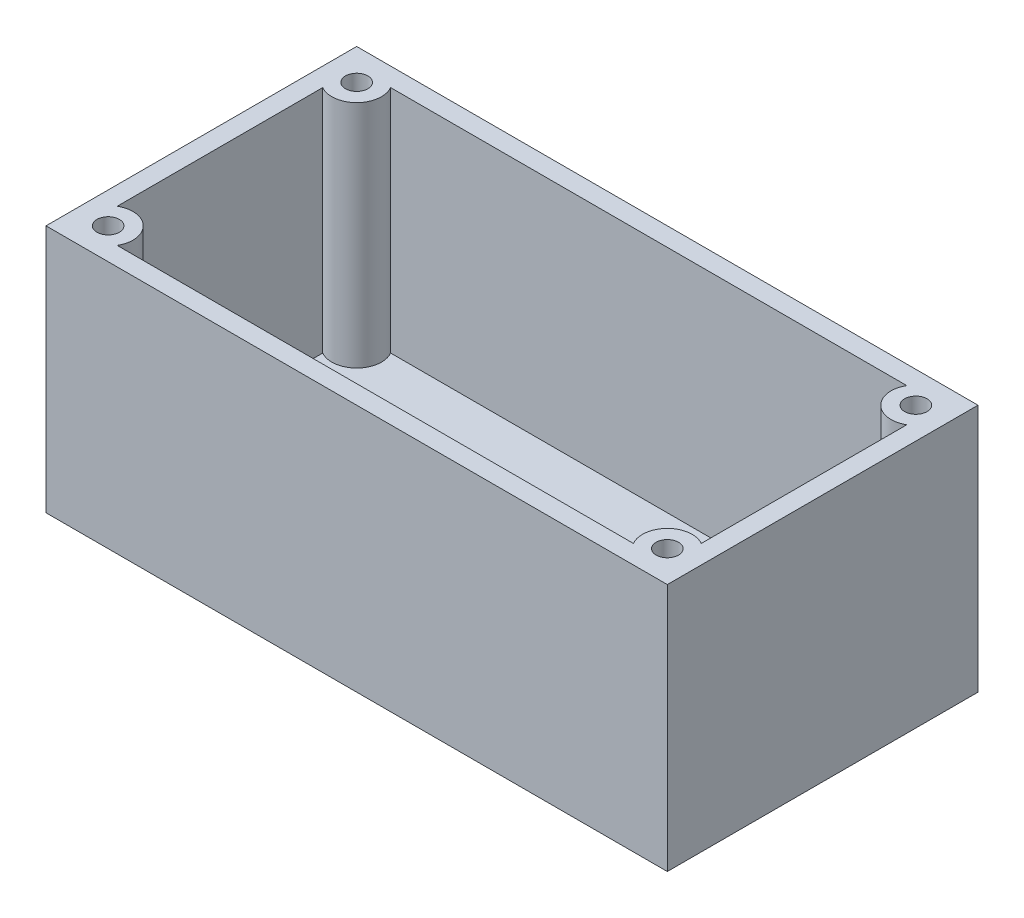
ISO-10303-21;
HEADER;
FILE_DESCRIPTION(('STEP AP214'),'2;1');
FILE_NAME('part.step','',(''),(''),'','','');
FILE_SCHEMA(('AUTOMOTIVE_DESIGN { 1 0 10303 214 1 1 1 1 }'));
ENDSEC;
DATA;
#1=APPLICATION_CONTEXT('core data for automotive mechanical design processes');
#2=APPLICATION_PROTOCOL_DEFINITION('international standard','automotive_design',2000,#1);
#3=PRODUCT_CONTEXT('',#1,'mechanical');
#4=PRODUCT('Part','Part','',(#3));
#5=PRODUCT_RELATED_PRODUCT_CATEGORY('part','',(#4));
#6=PRODUCT_DEFINITION_FORMATION('','',#4);
#7=PRODUCT_DEFINITION_CONTEXT('part definition',#1,'design');
#8=PRODUCT_DEFINITION('design','',#6,#7);
#9=PRODUCT_DEFINITION_SHAPE('','',#8);
#10=(LENGTH_UNIT() NAMED_UNIT(*) SI_UNIT(.MILLI.,.METRE.));
#11=(NAMED_UNIT(*) PLANE_ANGLE_UNIT() SI_UNIT($,.RADIAN.));
#12=(NAMED_UNIT(*) SI_UNIT($,.STERADIAN.) SOLID_ANGLE_UNIT());
#13=UNCERTAINTY_MEASURE_WITH_UNIT(LENGTH_MEASURE(1.E-05),#10,'distance_accuracy_value','');
#14=(GEOMETRIC_REPRESENTATION_CONTEXT(3) GLOBAL_UNCERTAINTY_ASSIGNED_CONTEXT((#13)) GLOBAL_UNIT_ASSIGNED_CONTEXT((#10,
#11,#12)) REPRESENTATION_CONTEXT('',''));
#15=CARTESIAN_POINT('',(0.,0.,0.));
#16=DIRECTION('',(0.,0.,1.));
#17=DIRECTION('',(1.,0.,0.));
#18=AXIS2_PLACEMENT_3D('',#15,#16,#17);
#19=CARTESIAN_POINT('',(0.,20.,-1.5));
#20=DIRECTION('',(0.,0.,-1.));
#21=DIRECTION('',(-1.,0.,0.));
#22=AXIS2_PLACEMENT_3D('',#19,#20,#21);
#23=PLANE('',#22);
#24=DIRECTION('',(1.,0.,0.));
#25=VECTOR('',#24,1.);
#26=CARTESIAN_POINT('',(0.,1.5,-1.5));
#27=LINE('',#26,#25);
#28=CARTESIAN_POINT('',(4.23205080756994,1.5,-1.5));
#29=VERTEX_POINT('',#28);
#30=CARTESIAN_POINT('',(45.7679491924322,1.5,-1.5));
#31=VERTEX_POINT('',#30);
#32=EDGE_CURVE('E141',#29,#31,#27,.T.);
#33=ORIENTED_EDGE('',*,*,#32,.F.);
#34=DIRECTION('',(0.,-1.,0.));
#35=VECTOR('',#34,1.);
#36=CARTESIAN_POINT('',(4.23205080756994,20.,-1.5));
#37=LINE('',#36,#35);
#38=CARTESIAN_POINT('',(4.23205080756994,20.,-1.5));
#39=VERTEX_POINT('',#38);
#40=EDGE_CURVE('E54',#29,#39,#37,.F.);
#41=ORIENTED_EDGE('',*,*,#40,.T.);
#42=DIRECTION('',(1.,0.,0.));
#43=VECTOR('',#42,1.);
#44=CARTESIAN_POINT('',(0.,20.,-1.5));
#45=LINE('',#44,#43);
#46=CARTESIAN_POINT('',(45.7679491924322,20.,-1.5));
#47=VERTEX_POINT('',#46);
#48=EDGE_CURVE('E139',#39,#47,#45,.T.);
#49=ORIENTED_EDGE('',*,*,#48,.T.);
#50=DIRECTION('',(0.,-1.,0.));
#51=VECTOR('',#50,1.);
#52=CARTESIAN_POINT('',(45.7679491924322,20.,-1.5));
#53=LINE('',#52,#51);
#54=EDGE_CURVE('E223',#47,#31,#53,.T.);
#55=ORIENTED_EDGE('',*,*,#54,.T.);
#56=EDGE_LOOP('',(#33,#41,#49,#55));
#57=FACE_BOUND('',#56,.T.);
#58=ADVANCED_FACE('F39',(#57),#23,.T.);
#59=CARTESIAN_POINT('',(1.5,20.,0.));
#60=DIRECTION('',(-1.,0.,0.));
#61=DIRECTION('',(0.,0.,1.));
#62=AXIS2_PLACEMENT_3D('',#59,#60,#61);
#63=PLANE('',#62);
#64=DIRECTION('',(0.,-1.,0.));
#65=VECTOR('',#64,1.);
#66=CARTESIAN_POINT('',(1.5,20.,-4.23205080756827));
#67=LINE('',#66,#65);
#68=CARTESIAN_POINT('',(1.5,1.5,-4.23205080756827));
#69=VERTEX_POINT('',#68);
#70=CARTESIAN_POINT('',(1.5,20.,-4.23205080756827));
#71=VERTEX_POINT('',#70);
#72=EDGE_CURVE('E130',#69,#71,#67,.F.);
#73=ORIENTED_EDGE('',*,*,#72,.F.);
#74=DIRECTION('',(0.,0.,-1.));
#75=VECTOR('',#74,1.);
#76=CARTESIAN_POINT('',(1.5,1.5,0.));
#77=LINE('',#76,#75);
#78=CARTESIAN_POINT('',(1.49999999999999,1.5,-20.7679491924311));
#79=VERTEX_POINT('',#78);
#80=EDGE_CURVE('E150',#69,#79,#77,.T.);
#81=ORIENTED_EDGE('',*,*,#80,.T.);
#82=DIRECTION('',(0.,-1.,0.));
#83=VECTOR('',#82,1.);
#84=CARTESIAN_POINT('',(1.49999999999999,20.,-20.7679491924311));
#85=LINE('',#84,#83);
#86=CARTESIAN_POINT('',(1.49999999999999,20.,-20.7679491924311));
#87=VERTEX_POINT('',#86);
#88=EDGE_CURVE('E243',#87,#79,#85,.T.);
#89=ORIENTED_EDGE('',*,*,#88,.F.);
#90=DIRECTION('',(0.,0.,-1.));
#91=VECTOR('',#90,1.);
#92=CARTESIAN_POINT('',(1.5,20.,0.));
#93=LINE('',#92,#91);
#94=EDGE_CURVE('E160',#71,#87,#93,.T.);
#95=ORIENTED_EDGE('',*,*,#94,.F.);
#96=EDGE_LOOP('',(#73,#81,#89,#95));
#97=FACE_BOUND('',#96,.T.);
#98=ADVANCED_FACE('F214',(#97),#63,.F.);
#99=CARTESIAN_POINT('',(48.5,20.,0.));
#100=DIRECTION('',(-1.,0.,0.));
#101=DIRECTION('',(0.,0.,1.));
#102=AXIS2_PLACEMENT_3D('',#99,#100,#101);
#103=PLANE('',#102);
#104=DIRECTION('',(0.,0.,-1.));
#105=VECTOR('',#104,1.);
#106=CARTESIAN_POINT('',(48.5,1.5,0.));
#107=LINE('',#106,#105);
#108=CARTESIAN_POINT('',(48.5,1.5,-4.2320508075695));
#109=VERTEX_POINT('',#108);
#110=CARTESIAN_POINT('',(48.5,1.5,-20.7679491924311));
#111=VERTEX_POINT('',#110);
#112=EDGE_CURVE('E248',#109,#111,#107,.T.);
#113=ORIENTED_EDGE('',*,*,#112,.F.);
#114=DIRECTION('',(0.,-1.,0.));
#115=VECTOR('',#114,1.);
#116=CARTESIAN_POINT('',(48.5,20.,-4.2320508075695));
#117=LINE('',#116,#115);
#118=CARTESIAN_POINT('',(48.5,20.,-4.23205080756949));
#119=VERTEX_POINT('',#118);
#120=EDGE_CURVE('E62',#109,#119,#117,.F.);
#121=ORIENTED_EDGE('',*,*,#120,.T.);
#122=DIRECTION('',(0.,0.,-1.));
#123=VECTOR('',#122,1.);
#124=CARTESIAN_POINT('',(48.5,20.,0.));
#125=LINE('',#124,#123);
#126=CARTESIAN_POINT('',(48.5,20.,-20.7679491924311));
#127=VERTEX_POINT('',#126);
#128=EDGE_CURVE('E149',#119,#127,#125,.T.);
#129=ORIENTED_EDGE('',*,*,#128,.T.);
#130=DIRECTION('',(0.,-1.,0.));
#131=VECTOR('',#130,1.);
#132=CARTESIAN_POINT('',(48.5,20.,-20.7679491924311));
#133=LINE('',#132,#131);
#134=EDGE_CURVE('E232',#127,#111,#133,.T.);
#135=ORIENTED_EDGE('',*,*,#134,.T.);
#136=EDGE_LOOP('',(#113,#121,#129,#135));
#137=FACE_BOUND('',#136,.T.);
#138=ADVANCED_FACE('F262',(#137),#103,.T.);
#139=CARTESIAN_POINT('',(0.,20.,-23.5));
#140=DIRECTION('',(0.,0.,-1.));
#141=DIRECTION('',(-1.,0.,0.));
#142=AXIS2_PLACEMENT_3D('',#139,#140,#141);
#143=PLANE('',#142);
#144=DIRECTION('',(0.,-1.,0.));
#145=VECTOR('',#144,1.);
#146=CARTESIAN_POINT('',(45.7679491924311,20.,-23.5));
#147=LINE('',#146,#145);
#148=CARTESIAN_POINT('',(45.7679491924311,20.,-23.5));
#149=VERTEX_POINT('',#148);
#150=CARTESIAN_POINT('',(45.7679491924311,1.5,-23.5));
#151=VERTEX_POINT('',#150);
#152=EDGE_CURVE('E235',#149,#151,#147,.T.);
#153=ORIENTED_EDGE('',*,*,#152,.F.);
#154=DIRECTION('',(1.,0.,0.));
#155=VECTOR('',#154,1.);
#156=CARTESIAN_POINT('',(0.,20.,-23.5));
#157=LINE('',#156,#155);
#158=CARTESIAN_POINT('',(4.23205080756888,20.,-23.5));
#159=VERTEX_POINT('',#158);
#160=EDGE_CURVE('E152',#159,#149,#157,.T.);
#161=ORIENTED_EDGE('',*,*,#160,.F.);
#162=DIRECTION('',(0.,-1.,0.));
#163=VECTOR('',#162,1.);
#164=CARTESIAN_POINT('',(4.23205080756888,20.,-23.5));
#165=LINE('',#164,#163);
#166=CARTESIAN_POINT('',(4.23205080756888,1.5,-23.5));
#167=VERTEX_POINT('',#166);
#168=EDGE_CURVE('E245',#167,#159,#165,.F.);
#169=ORIENTED_EDGE('',*,*,#168,.F.);
#170=DIRECTION('',(1.,0.,0.));
#171=VECTOR('',#170,1.);
#172=CARTESIAN_POINT('',(0.,1.5,-23.5));
#173=LINE('',#172,#171);
#174=EDGE_CURVE('E154',#167,#151,#173,.T.);
#175=ORIENTED_EDGE('',*,*,#174,.T.);
#176=EDGE_LOOP('',(#153,#161,#169,#175));
#177=FACE_BOUND('',#176,.T.);
#178=ADVANCED_FACE('F254',(#177),#143,.F.);
#179=CARTESIAN_POINT('',(0.,20.,0.));
#180=DIRECTION('',(0.,0.,-1.));
#181=DIRECTION('',(-1.,0.,0.));
#182=AXIS2_PLACEMENT_3D('',#179,#180,#181);
#183=PLANE('',#182);
#184=DIRECTION('',(1.,0.,0.));
#185=VECTOR('',#184,1.);
#186=CARTESIAN_POINT('',(0.,0.,0.));
#187=LINE('',#186,#185);
#188=CARTESIAN_POINT('',(0.,0.,0.));
#189=VERTEX_POINT('',#188);
#190=CARTESIAN_POINT('',(50.,0.,0.));
#191=VERTEX_POINT('',#190);
#192=EDGE_CURVE('E162',#189,#191,#187,.T.);
#193=ORIENTED_EDGE('',*,*,#192,.T.);
#194=DIRECTION('',(0.,-1.,0.));
#195=VECTOR('',#194,1.);
#196=CARTESIAN_POINT('',(50.,20.,0.));
#197=LINE('',#196,#195);
#198=CARTESIAN_POINT('',(50.,20.,0.));
#199=VERTEX_POINT('',#198);
#200=EDGE_CURVE('E191',#199,#191,#197,.T.);
#201=ORIENTED_EDGE('',*,*,#200,.F.);
#202=DIRECTION('',(1.,0.,0.));
#203=VECTOR('',#202,1.);
#204=CARTESIAN_POINT('',(0.,20.,0.));
#205=LINE('',#204,#203);
#206=CARTESIAN_POINT('',(0.,20.,0.));
#207=VERTEX_POINT('',#206);
#208=EDGE_CURVE('E163',#207,#199,#205,.T.);
#209=ORIENTED_EDGE('',*,*,#208,.F.);
#210=DIRECTION('',(0.,-1.,0.));
#211=VECTOR('',#210,1.);
#212=CARTESIAN_POINT('',(0.,20.,0.));
#213=LINE('',#212,#211);
#214=EDGE_CURVE('E175',#207,#189,#213,.T.);
#215=ORIENTED_EDGE('',*,*,#214,.T.);
#216=EDGE_LOOP('',(#193,#201,#209,#215));
#217=FACE_BOUND('',#216,.T.);
#218=ADVANCED_FACE('F41',(#217),#183,.F.);
#219=CARTESIAN_POINT('',(50.,20.,0.));
#220=DIRECTION('',(-1.,0.,0.));
#221=DIRECTION('',(0.,0.,1.));
#222=AXIS2_PLACEMENT_3D('',#219,#220,#221);
#223=PLANE('',#222);
#224=DIRECTION('',(0.,0.,-1.));
#225=VECTOR('',#224,1.);
#226=CARTESIAN_POINT('',(50.,0.,0.));
#227=LINE('',#226,#225);
#228=CARTESIAN_POINT('',(50.,0.,-25.));
#229=VERTEX_POINT('',#228);
#230=EDGE_CURVE('E178',#191,#229,#227,.T.);
#231=ORIENTED_EDGE('',*,*,#230,.T.);
#232=DIRECTION('',(0.,-1.,0.));
#233=VECTOR('',#232,1.);
#234=CARTESIAN_POINT('',(50.,20.,-25.));
#235=LINE('',#234,#233);
#236=CARTESIAN_POINT('',(50.,20.,-25.));
#237=VERTEX_POINT('',#236);
#238=EDGE_CURVE('E189',#237,#229,#235,.T.);
#239=ORIENTED_EDGE('',*,*,#238,.F.);
#240=DIRECTION('',(0.,0.,-1.));
#241=VECTOR('',#240,1.);
#242=CARTESIAN_POINT('',(50.,20.,0.));
#243=LINE('',#242,#241);
#244=EDGE_CURVE('E166',#199,#237,#243,.T.);
#245=ORIENTED_EDGE('',*,*,#244,.F.);
#246=ORIENTED_EDGE('',*,*,#200,.T.);
#247=EDGE_LOOP('',(#231,#239,#245,#246));
#248=FACE_BOUND('',#247,.T.);
#249=ADVANCED_FACE('F302',(#248),#223,.F.);
#250=CARTESIAN_POINT('',(0.,20.,-25.));
#251=DIRECTION('',(0.,0.,-1.));
#252=DIRECTION('',(-1.,0.,0.));
#253=AXIS2_PLACEMENT_3D('',#250,#251,#252);
#254=PLANE('',#253);
#255=DIRECTION('',(1.,0.,0.));
#256=VECTOR('',#255,1.);
#257=CARTESIAN_POINT('',(0.,0.,-25.));
#258=LINE('',#257,#256);
#259=CARTESIAN_POINT('',(0.,0.,-25.));
#260=VERTEX_POINT('',#259);
#261=EDGE_CURVE('E181',#260,#229,#258,.T.);
#262=ORIENTED_EDGE('',*,*,#261,.F.);
#263=DIRECTION('',(0.,-1.,0.));
#264=VECTOR('',#263,1.);
#265=CARTESIAN_POINT('',(0.,20.,-25.));
#266=LINE('',#265,#264);
#267=CARTESIAN_POINT('',(0.,20.,-25.));
#268=VERTEX_POINT('',#267);
#269=EDGE_CURVE('E187',#268,#260,#266,.T.);
#270=ORIENTED_EDGE('',*,*,#269,.F.);
#271=DIRECTION('',(1.,0.,0.));
#272=VECTOR('',#271,1.);
#273=CARTESIAN_POINT('',(0.,20.,-25.));
#274=LINE('',#273,#272);
#275=EDGE_CURVE('E169',#268,#237,#274,.T.);
#276=ORIENTED_EDGE('',*,*,#275,.T.);
#277=ORIENTED_EDGE('',*,*,#238,.T.);
#278=EDGE_LOOP('',(#262,#270,#276,#277));
#279=FACE_BOUND('',#278,.T.);
#280=ADVANCED_FACE('F299',(#279),#254,.T.);
#281=CARTESIAN_POINT('',(0.,20.,0.));
#282=DIRECTION('',(-1.,0.,0.));
#283=DIRECTION('',(0.,0.,1.));
#284=AXIS2_PLACEMENT_3D('',#281,#282,#283);
#285=PLANE('',#284);
#286=DIRECTION('',(0.,0.,-1.));
#287=VECTOR('',#286,1.);
#288=CARTESIAN_POINT('',(0.,0.,0.));
#289=LINE('',#288,#287);
#290=EDGE_CURVE('E167',#189,#260,#289,.T.);
#291=ORIENTED_EDGE('',*,*,#290,.F.);
#292=ORIENTED_EDGE('',*,*,#214,.F.);
#293=DIRECTION('',(0.,0.,-1.));
#294=VECTOR('',#293,1.);
#295=CARTESIAN_POINT('',(0.,20.,0.));
#296=LINE('',#295,#294);
#297=EDGE_CURVE('E172',#207,#268,#296,.T.);
#298=ORIENTED_EDGE('',*,*,#297,.T.);
#299=ORIENTED_EDGE('',*,*,#269,.T.);
#300=EDGE_LOOP('',(#291,#292,#298,#299));
#301=FACE_BOUND('',#300,.T.);
#302=ADVANCED_FACE('F293',(#301),#285,.T.);
#303=CARTESIAN_POINT('',(0.,20.,0.));
#304=DIRECTION('',(0.,1.,0.));
#305=DIRECTION('',(0.,0.,1.));
#306=AXIS2_PLACEMENT_3D('',#303,#304,#305);
#307=PLANE('',#306);
#308=ORIENTED_EDGE('',*,*,#48,.F.);
#309=CARTESIAN_POINT('',(2.50000000000106,20.,-2.5));
#310=DIRECTION('',(0.,1.,0.));
#311=DIRECTION('',(0.,0.,1.));
#312=AXIS2_PLACEMENT_3D('',#309,#310,#311);
#313=CIRCLE('',#312,2.);
#314=EDGE_CURVE('E127',#39,#71,#313,.T.);
#315=ORIENTED_EDGE('',*,*,#314,.T.);
#316=ORIENTED_EDGE('',*,*,#94,.T.);
#317=CARTESIAN_POINT('',(2.5,20.,-22.5));
#318=DIRECTION('',(0.,1.,0.));
#319=DIRECTION('',(0.,0.,1.));
#320=AXIS2_PLACEMENT_3D('',#317,#318,#319);
#321=CIRCLE('',#320,2.);
#322=EDGE_CURVE('E240',#87,#159,#321,.T.);
#323=ORIENTED_EDGE('',*,*,#322,.T.);
#324=ORIENTED_EDGE('',*,*,#160,.T.);
#325=CARTESIAN_POINT('',(47.5,20.,-22.5));
#326=DIRECTION('',(0.,1.,0.));
#327=DIRECTION('',(0.,0.,1.));
#328=AXIS2_PLACEMENT_3D('',#325,#326,#327);
#329=CIRCLE('',#328,2.);
#330=EDGE_CURVE('E229',#149,#127,#329,.T.);
#331=ORIENTED_EDGE('',*,*,#330,.T.);
#332=ORIENTED_EDGE('',*,*,#128,.F.);
#333=CARTESIAN_POINT('',(47.5000000000011,20.,-2.5));
#334=DIRECTION('',(0.,1.,0.));
#335=DIRECTION('',(0.,0.,1.));
#336=AXIS2_PLACEMENT_3D('',#333,#334,#335);
#337=CIRCLE('',#336,2.);
#338=EDGE_CURVE('E148',#119,#47,#337,.T.);
#339=ORIENTED_EDGE('',*,*,#338,.T.);
#340=EDGE_LOOP('',(#308,#315,#316,#323,#324,#331,#332,#339));
#341=FACE_BOUND('',#340,.T.);
#342=ORIENTED_EDGE('',*,*,#208,.T.);
#343=ORIENTED_EDGE('',*,*,#244,.T.);
#344=ORIENTED_EDGE('',*,*,#275,.F.);
#345=ORIENTED_EDGE('',*,*,#297,.F.);
#346=EDGE_LOOP('',(#342,#343,#344,#345));
#347=FACE_BOUND('',#346,.T.);
#348=CARTESIAN_POINT('',(2.5,20.,-22.5));
#349=DIRECTION('',(0.,1.,0.));
#350=DIRECTION('',(0.,0.,1.));
#351=AXIS2_PLACEMENT_3D('',#348,#349,#350);
#352=CIRCLE('',#351,0.900000000000001);
#353=CARTESIAN_POINT('',(2.5,20.,-21.6));
#354=VERTEX_POINT('',#353);
#355=EDGE_CURVE('E237',#354,#354,#352,.T.);
#356=ORIENTED_EDGE('',*,*,#355,.F.);
#357=EDGE_LOOP('',(#356));
#358=FACE_BOUND('',#357,.T.);
#359=CARTESIAN_POINT('',(47.5,20.,-22.5));
#360=DIRECTION('',(0.,1.,0.));
#361=DIRECTION('',(0.,0.,1.));
#362=AXIS2_PLACEMENT_3D('',#359,#360,#361);
#363=CIRCLE('',#362,0.899999999999996);
#364=CARTESIAN_POINT('',(47.5,20.,-21.6));
#365=VERTEX_POINT('',#364);
#366=EDGE_CURVE('E226',#365,#365,#363,.T.);
#367=ORIENTED_EDGE('',*,*,#366,.F.);
#368=EDGE_LOOP('',(#367));
#369=FACE_BOUND('',#368,.T.);
#370=CARTESIAN_POINT('',(47.5000000000011,20.,-2.5));
#371=DIRECTION('',(0.,1.,0.));
#372=DIRECTION('',(0.,0.,1.));
#373=AXIS2_PLACEMENT_3D('',#370,#371,#372);
#374=CIRCLE('',#373,0.899999999999997);
#375=CARTESIAN_POINT('',(47.5000000000011,20.,-1.60000000000001));
#376=VERTEX_POINT('',#375);
#377=EDGE_CURVE('E142',#376,#376,#374,.T.);
#378=ORIENTED_EDGE('',*,*,#377,.F.);
#379=EDGE_LOOP('',(#378));
#380=FACE_BOUND('',#379,.T.);
#381=CARTESIAN_POINT('',(2.50000000000106,20.,-2.5));
#382=DIRECTION('',(0.,1.,0.));
#383=DIRECTION('',(0.,0.,1.));
#384=AXIS2_PLACEMENT_3D('',#381,#382,#383);
#385=CIRCLE('',#384,0.9);
#386=CARTESIAN_POINT('',(2.50000000000106,20.,-1.6));
#387=VERTEX_POINT('',#386);
#388=EDGE_CURVE('E134',#387,#387,#385,.T.);
#389=ORIENTED_EDGE('',*,*,#388,.F.);
#390=EDGE_LOOP('',(#389));
#391=FACE_BOUND('',#390,.T.);
#392=ADVANCED_FACE('F145',(#341,#347,#358,#369,#380,#391),#307,.T.);
#393=CARTESIAN_POINT('',(0.,0.,0.));
#394=DIRECTION('',(0.,1.,0.));
#395=DIRECTION('',(0.,0.,1.));
#396=AXIS2_PLACEMENT_3D('',#393,#394,#395);
#397=PLANE('',#396);
#398=ORIENTED_EDGE('',*,*,#192,.F.);
#399=ORIENTED_EDGE('',*,*,#290,.T.);
#400=ORIENTED_EDGE('',*,*,#261,.T.);
#401=ORIENTED_EDGE('',*,*,#230,.F.);
#402=EDGE_LOOP('',(#398,#399,#400,#401));
#403=FACE_BOUND('',#402,.T.);
#404=ADVANCED_FACE('F276',(#403),#397,.F.);
#405=CARTESIAN_POINT('',(0.,1.5,0.));
#406=DIRECTION('',(0.,1.,0.));
#407=DIRECTION('',(0.,0.,1.));
#408=AXIS2_PLACEMENT_3D('',#405,#406,#407);
#409=PLANE('',#408);
#410=ORIENTED_EDGE('',*,*,#80,.F.);
#411=CARTESIAN_POINT('',(2.50000000000106,1.5,-2.5));
#412=DIRECTION('',(0.,1.,0.));
#413=DIRECTION('',(0.,0.,1.));
#414=AXIS2_PLACEMENT_3D('',#411,#412,#413);
#415=CIRCLE('',#414,2.);
#416=EDGE_CURVE('E47',#69,#29,#415,.F.);
#417=ORIENTED_EDGE('',*,*,#416,.T.);
#418=ORIENTED_EDGE('',*,*,#32,.T.);
#419=CARTESIAN_POINT('',(47.5000000000011,1.5,-2.5));
#420=DIRECTION('',(0.,1.,0.));
#421=DIRECTION('',(0.,0.,1.));
#422=AXIS2_PLACEMENT_3D('',#419,#420,#421);
#423=CIRCLE('',#422,2.);
#424=EDGE_CURVE('E206',#31,#109,#423,.F.);
#425=ORIENTED_EDGE('',*,*,#424,.T.);
#426=ORIENTED_EDGE('',*,*,#112,.T.);
#427=CARTESIAN_POINT('',(47.5,1.5,-22.5));
#428=DIRECTION('',(0.,1.,0.));
#429=DIRECTION('',(0.,0.,1.));
#430=AXIS2_PLACEMENT_3D('',#427,#428,#429);
#431=CIRCLE('',#430,2.);
#432=EDGE_CURVE('E200',#111,#151,#431,.F.);
#433=ORIENTED_EDGE('',*,*,#432,.T.);
#434=ORIENTED_EDGE('',*,*,#174,.F.);
#435=CARTESIAN_POINT('',(2.5,1.5,-22.5));
#436=DIRECTION('',(0.,1.,0.));
#437=DIRECTION('',(0.,0.,1.));
#438=AXIS2_PLACEMENT_3D('',#435,#436,#437);
#439=CIRCLE('',#438,2.);
#440=EDGE_CURVE('E194',#167,#79,#439,.F.);
#441=ORIENTED_EDGE('',*,*,#440,.T.);
#442=EDGE_LOOP('',(#410,#417,#418,#425,#426,#433,#434,#441));
#443=FACE_BOUND('',#442,.T.);
#444=ADVANCED_FACE('F212',(#443),#409,.T.);
#445=CARTESIAN_POINT('',(2.5,20.,-22.5));
#446=DIRECTION('',(0.,-1.,0.));
#447=DIRECTION('',(0.,0.,-1.));
#448=AXIS2_PLACEMENT_3D('',#445,#446,#447);
#449=CYLINDRICAL_SURFACE('',#448,2.);
#450=ORIENTED_EDGE('',*,*,#440,.F.);
#451=ORIENTED_EDGE('',*,*,#168,.T.);
#452=ORIENTED_EDGE('',*,*,#322,.F.);
#453=ORIENTED_EDGE('',*,*,#88,.T.);
#454=EDGE_LOOP('',(#450,#451,#452,#453));
#455=FACE_BOUND('',#454,.T.);
#456=ADVANCED_FACE('F265',(#455),#449,.T.);
#457=CARTESIAN_POINT('',(2.5,20.,-22.5));
#458=DIRECTION('',(0.,-1.,0.));
#459=DIRECTION('',(0.,0.,-1.));
#460=AXIS2_PLACEMENT_3D('',#457,#458,#459);
#461=CYLINDRICAL_SURFACE('',#460,0.900000000000001);
#462=CARTESIAN_POINT('',(2.5,1.5,-22.5));
#463=DIRECTION('',(0.,1.,0.));
#464=DIRECTION('',(0.,0.,1.));
#465=AXIS2_PLACEMENT_3D('',#462,#463,#464);
#466=CIRCLE('',#465,0.900000000000001);
#467=CARTESIAN_POINT('',(2.5,1.5,-21.6));
#468=VERTEX_POINT('',#467);
#469=EDGE_CURVE('E197',#468,#468,#466,.F.);
#470=ORIENTED_EDGE('',*,*,#469,.T.);
#471=EDGE_LOOP('',(#470));
#472=FACE_BOUND('',#471,.T.);
#473=ORIENTED_EDGE('',*,*,#355,.T.);
#474=EDGE_LOOP('',(#473));
#475=FACE_BOUND('',#474,.T.);
#476=ADVANCED_FACE('F267',(#472,#475),#461,.F.);
#477=ORIENTED_EDGE('',*,*,#469,.F.);
#478=EDGE_LOOP('',(#477));
#479=FACE_BOUND('',#478,.T.);
#480=ADVANCED_FACE('F273',(#479),#409,.T.);
#481=CARTESIAN_POINT('',(47.5,20.,-22.5));
#482=DIRECTION('',(0.,-1.,0.));
#483=DIRECTION('',(0.,0.,-1.));
#484=AXIS2_PLACEMENT_3D('',#481,#482,#483);
#485=CYLINDRICAL_SURFACE('',#484,2.);
#486=ORIENTED_EDGE('',*,*,#330,.F.);
#487=ORIENTED_EDGE('',*,*,#152,.T.);
#488=ORIENTED_EDGE('',*,*,#432,.F.);
#489=ORIENTED_EDGE('',*,*,#134,.F.);
#490=EDGE_LOOP('',(#486,#487,#488,#489));
#491=FACE_BOUND('',#490,.T.);
#492=ADVANCED_FACE('F260',(#491),#485,.T.);
#493=CARTESIAN_POINT('',(47.5,20.,-22.5));
#494=DIRECTION('',(0.,-1.,0.));
#495=DIRECTION('',(0.,0.,-1.));
#496=AXIS2_PLACEMENT_3D('',#493,#494,#495);
#497=CYLINDRICAL_SURFACE('',#496,0.899999999999996);
#498=CARTESIAN_POINT('',(47.5,1.5,-22.5));
#499=DIRECTION('',(0.,1.,0.));
#500=DIRECTION('',(0.,0.,1.));
#501=AXIS2_PLACEMENT_3D('',#498,#499,#500);
#502=CIRCLE('',#501,0.899999999999996);
#503=CARTESIAN_POINT('',(47.5,1.5,-21.6));
#504=VERTEX_POINT('',#503);
#505=EDGE_CURVE('E203',#504,#504,#502,.F.);
#506=ORIENTED_EDGE('',*,*,#505,.T.);
#507=EDGE_LOOP('',(#506));
#508=FACE_BOUND('',#507,.T.);
#509=ORIENTED_EDGE('',*,*,#366,.T.);
#510=EDGE_LOOP('',(#509));
#511=FACE_BOUND('',#510,.T.);
#512=ADVANCED_FACE('F349',(#508,#511),#497,.F.);
#513=ORIENTED_EDGE('',*,*,#505,.F.);
#514=EDGE_LOOP('',(#513));
#515=FACE_BOUND('',#514,.T.);
#516=ADVANCED_FACE('F340',(#515),#409,.T.);
#517=CARTESIAN_POINT('',(47.5000000000011,20.,-2.5));
#518=DIRECTION('',(0.,-1.,0.));
#519=DIRECTION('',(0.,0.,-1.));
#520=AXIS2_PLACEMENT_3D('',#517,#518,#519);
#521=CYLINDRICAL_SURFACE('',#520,0.899999999999997);
#522=CARTESIAN_POINT('',(47.5000000000011,1.5,-2.5));
#523=DIRECTION('',(0.,1.,0.));
#524=DIRECTION('',(0.,0.,1.));
#525=AXIS2_PLACEMENT_3D('',#522,#523,#524);
#526=CIRCLE('',#525,0.899999999999997);
#527=CARTESIAN_POINT('',(47.5000000000011,1.5,-1.60000000000001));
#528=VERTEX_POINT('',#527);
#529=EDGE_CURVE('E208',#528,#528,#526,.F.);
#530=ORIENTED_EDGE('',*,*,#529,.T.);
#531=EDGE_LOOP('',(#530));
#532=FACE_BOUND('',#531,.T.);
#533=ORIENTED_EDGE('',*,*,#377,.T.);
#534=EDGE_LOOP('',(#533));
#535=FACE_BOUND('',#534,.T.);
#536=ADVANCED_FACE('F344',(#532,#535),#521,.F.);
#537=CARTESIAN_POINT('',(47.5000000000011,20.,-2.5));
#538=DIRECTION('',(0.,-1.,0.));
#539=DIRECTION('',(0.,0.,-1.));
#540=AXIS2_PLACEMENT_3D('',#537,#538,#539);
#541=CYLINDRICAL_SURFACE('',#540,2.);
#542=ORIENTED_EDGE('',*,*,#120,.F.);
#543=ORIENTED_EDGE('',*,*,#424,.F.);
#544=ORIENTED_EDGE('',*,*,#54,.F.);
#545=ORIENTED_EDGE('',*,*,#338,.F.);
#546=EDGE_LOOP('',(#542,#543,#544,#545));
#547=FACE_BOUND('',#546,.T.);
#548=ADVANCED_FACE('F338',(#547),#541,.T.);
#549=ORIENTED_EDGE('',*,*,#529,.F.);
#550=EDGE_LOOP('',(#549));
#551=FACE_BOUND('',#550,.T.);
#552=ADVANCED_FACE('F330',(#551),#409,.T.);
#553=CARTESIAN_POINT('',(2.50000000000106,20.,-2.5));
#554=DIRECTION('',(0.,-1.,0.));
#555=DIRECTION('',(0.,0.,-1.));
#556=AXIS2_PLACEMENT_3D('',#553,#554,#555);
#557=CYLINDRICAL_SURFACE('',#556,0.9);
#558=CARTESIAN_POINT('',(2.50000000000106,1.5,-2.5));
#559=DIRECTION('',(0.,1.,0.));
#560=DIRECTION('',(0.,0.,1.));
#561=AXIS2_PLACEMENT_3D('',#558,#559,#560);
#562=CIRCLE('',#561,0.9);
#563=CARTESIAN_POINT('',(2.50000000000106,1.5,-1.6));
#564=VERTEX_POINT('',#563);
#565=EDGE_CURVE('E11',#564,#564,#562,.F.);
#566=ORIENTED_EDGE('',*,*,#565,.T.);
#567=EDGE_LOOP('',(#566));
#568=FACE_BOUND('',#567,.T.);
#569=ORIENTED_EDGE('',*,*,#388,.T.);
#570=EDGE_LOOP('',(#569));
#571=FACE_BOUND('',#570,.T.);
#572=ADVANCED_FACE('F328',(#568,#571),#557,.F.);
#573=CARTESIAN_POINT('',(2.50000000000106,20.,-2.5));
#574=DIRECTION('',(0.,-1.,0.));
#575=DIRECTION('',(0.,0.,-1.));
#576=AXIS2_PLACEMENT_3D('',#573,#574,#575);
#577=CYLINDRICAL_SURFACE('',#576,2.);
#578=ORIENTED_EDGE('',*,*,#40,.F.);
#579=ORIENTED_EDGE('',*,*,#416,.F.);
#580=ORIENTED_EDGE('',*,*,#72,.T.);
#581=ORIENTED_EDGE('',*,*,#314,.F.);
#582=EDGE_LOOP('',(#578,#579,#580,#581));
#583=FACE_BOUND('',#582,.T.);
#584=ADVANCED_FACE('F128',(#583),#577,.T.);
#585=ORIENTED_EDGE('',*,*,#565,.F.);
#586=EDGE_LOOP('',(#585));
#587=FACE_BOUND('',#586,.T.);
#588=ADVANCED_FACE('F278',(#587),#409,.T.);
#589=CLOSED_SHELL('',(#58,#98,#138,#178,#218,#249,#280,#302,#392,#404,#444,#456,#476,#480,#492,
#512,#516,#536,#548,#552,#572,#584,#588));
#590=MANIFOLD_SOLID_BREP('B2',#589);
#591=ADVANCED_BREP_SHAPE_REPRESENTATION('',(#18,#590),#14);
#592=SHAPE_DEFINITION_REPRESENTATION(#9,#591);
ENDSEC;
END-ISO-10303-21;
